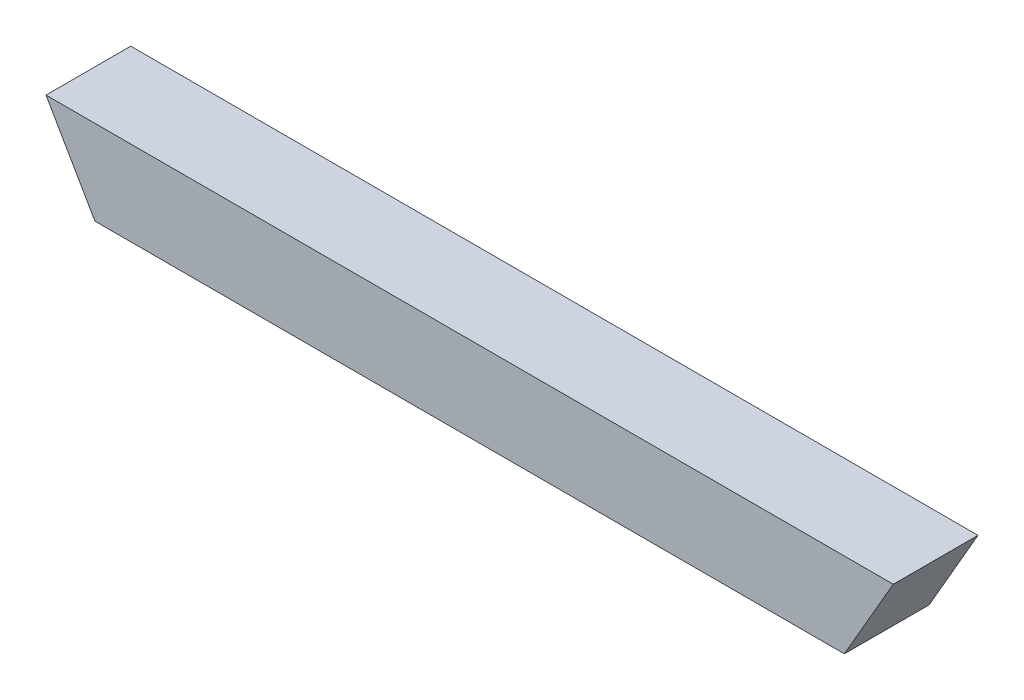
ISO-10303-21;
HEADER;
FILE_DESCRIPTION(('STEP AP214'),'2;1');
FILE_NAME('part.step','',(''),(''),'','','');
FILE_SCHEMA(('AUTOMOTIVE_DESIGN { 1 0 10303 214 1 1 1 1 }'));
ENDSEC;
DATA;
#1=APPLICATION_CONTEXT('core data for automotive mechanical design processes');
#2=APPLICATION_PROTOCOL_DEFINITION('international standard','automotive_design',2000,#1);
#3=PRODUCT_CONTEXT('',#1,'mechanical');
#4=PRODUCT('Part','Part','',(#3));
#5=PRODUCT_RELATED_PRODUCT_CATEGORY('part','',(#4));
#6=PRODUCT_DEFINITION_FORMATION('','',#4);
#7=PRODUCT_DEFINITION_CONTEXT('part definition',#1,'design');
#8=PRODUCT_DEFINITION('design','',#6,#7);
#9=PRODUCT_DEFINITION_SHAPE('','',#8);
#10=(LENGTH_UNIT() NAMED_UNIT(*) SI_UNIT(.MILLI.,.METRE.));
#11=(NAMED_UNIT(*) PLANE_ANGLE_UNIT() SI_UNIT($,.RADIAN.));
#12=(NAMED_UNIT(*) SI_UNIT($,.STERADIAN.) SOLID_ANGLE_UNIT());
#13=UNCERTAINTY_MEASURE_WITH_UNIT(LENGTH_MEASURE(1.E-05),#10,'distance_accuracy_value','');
#14=(GEOMETRIC_REPRESENTATION_CONTEXT(3) GLOBAL_UNCERTAINTY_ASSIGNED_CONTEXT((#13)) GLOBAL_UNIT_ASSIGNED_CONTEXT((#10,
#11,#12)) REPRESENTATION_CONTEXT('',''));
#15=CARTESIAN_POINT('',(0.,0.,0.));
#16=DIRECTION('',(0.,0.,1.));
#17=DIRECTION('',(1.,0.,0.));
#18=AXIS2_PLACEMENT_3D('',#15,#16,#17);
#19=CARTESIAN_POINT('',(88.4529946162075,-19.9999999999999,20.));
#20=DIRECTION('',(-0.866025403784439,0.499999999999999,0.));
#21=DIRECTION('',(-0.499999999999999,-0.866025403784439,0.));
#22=AXIS2_PLACEMENT_3D('',#19,#20,#21);
#23=PLANE('',#22);
#24=DIRECTION('',(0.499999999999999,0.866025403784439,0.));
#25=VECTOR('',#24,1.);
#26=CARTESIAN_POINT('',(88.4529946162075,-19.9999999999999,0.));
#27=LINE('',#26,#25);
#28=CARTESIAN_POINT('',(88.4529946162075,-19.9999999999999,0.));
#29=VERTEX_POINT('',#28);
#30=CARTESIAN_POINT('',(100.,0.,0.));
#31=VERTEX_POINT('',#30);
#32=EDGE_CURVE('E96',#29,#31,#27,.T.);
#33=ORIENTED_EDGE('',*,*,#32,.T.);
#34=DIRECTION('',(0.,0.,-1.));
#35=VECTOR('',#34,1.);
#36=CARTESIAN_POINT('',(100.,0.,20.));
#37=LINE('',#36,#35);
#38=CARTESIAN_POINT('',(100.,0.,20.));
#39=VERTEX_POINT('',#38);
#40=EDGE_CURVE('E11',#39,#31,#37,.T.);
#41=ORIENTED_EDGE('',*,*,#40,.F.);
#42=DIRECTION('',(0.499999999999999,0.866025403784439,0.));
#43=VECTOR('',#42,1.);
#44=CARTESIAN_POINT('',(88.4529946162075,-19.9999999999999,20.));
#45=LINE('',#44,#43);
#46=CARTESIAN_POINT('',(88.4529946162075,-19.9999999999999,20.));
#47=VERTEX_POINT('',#46);
#48=EDGE_CURVE('E84',#47,#39,#45,.T.);
#49=ORIENTED_EDGE('',*,*,#48,.F.);
#50=DIRECTION('',(0.,0.,-1.));
#51=VECTOR('',#50,1.);
#52=CARTESIAN_POINT('',(88.4529946162075,-19.9999999999999,20.));
#53=LINE('',#52,#51);
#54=EDGE_CURVE('E92',#47,#29,#53,.T.);
#55=ORIENTED_EDGE('',*,*,#54,.T.);
#56=EDGE_LOOP('',(#33,#41,#49,#55));
#57=FACE_BOUND('',#56,.T.);
#58=ADVANCED_FACE('F33',(#57),#23,.F.);
#59=CARTESIAN_POINT('',(-100.,0.,20.));
#60=DIRECTION('',(0.,-1.,0.));
#61=DIRECTION('',(1.,0.,0.));
#62=AXIS2_PLACEMENT_3D('',#59,#60,#61);
#63=PLANE('',#62);
#64=DIRECTION('',(-1.,0.,0.));
#65=VECTOR('',#64,1.);
#66=CARTESIAN_POINT('',(-100.,0.,0.));
#67=LINE('',#66,#65);
#68=CARTESIAN_POINT('',(-100.,0.,0.));
#69=VERTEX_POINT('',#68);
#70=EDGE_CURVE('E88',#31,#69,#67,.T.);
#71=ORIENTED_EDGE('',*,*,#70,.T.);
#72=DIRECTION('',(0.,0.,-1.));
#73=VECTOR('',#72,1.);
#74=CARTESIAN_POINT('',(-100.,0.,20.));
#75=LINE('',#74,#73);
#76=CARTESIAN_POINT('',(-100.,0.,20.));
#77=VERTEX_POINT('',#76);
#78=EDGE_CURVE('E41',#77,#69,#75,.T.);
#79=ORIENTED_EDGE('',*,*,#78,.F.);
#80=DIRECTION('',(-1.,0.,0.));
#81=VECTOR('',#80,1.);
#82=CARTESIAN_POINT('',(-100.,0.,20.));
#83=LINE('',#82,#81);
#84=EDGE_CURVE('E79',#39,#77,#83,.T.);
#85=ORIENTED_EDGE('',*,*,#84,.F.);
#86=ORIENTED_EDGE('',*,*,#40,.T.);
#87=EDGE_LOOP('',(#71,#79,#85,#86));
#88=FACE_BOUND('',#87,.T.);
#89=ADVANCED_FACE('F87',(#88),#63,.F.);
#90=CARTESIAN_POINT('',(-100.,0.,20.));
#91=DIRECTION('',(0.86602540378444,0.499999999999998,0.));
#92=DIRECTION('',(-0.499999999999998,0.86602540378444,0.));
#93=AXIS2_PLACEMENT_3D('',#90,#91,#92);
#94=PLANE('',#93);
#95=DIRECTION('',(0.499999999999998,-0.86602540378444,0.));
#96=VECTOR('',#95,1.);
#97=CARTESIAN_POINT('',(-100.,0.,0.));
#98=LINE('',#97,#96);
#99=CARTESIAN_POINT('',(-88.4529946162075,-20.,0.));
#100=VERTEX_POINT('',#99);
#101=EDGE_CURVE('E66',#69,#100,#98,.T.);
#102=ORIENTED_EDGE('',*,*,#101,.T.);
#103=DIRECTION('',(0.,0.,-1.));
#104=VECTOR('',#103,1.);
#105=CARTESIAN_POINT('',(-88.4529946162075,-20.,20.));
#106=LINE('',#105,#104);
#107=CARTESIAN_POINT('',(-88.4529946162075,-20.,20.));
#108=VERTEX_POINT('',#107);
#109=EDGE_CURVE('E89',#108,#100,#106,.T.);
#110=ORIENTED_EDGE('',*,*,#109,.F.);
#111=DIRECTION('',(0.499999999999998,-0.86602540378444,0.));
#112=VECTOR('',#111,1.);
#113=CARTESIAN_POINT('',(-100.,0.,20.));
#114=LINE('',#113,#112);
#115=EDGE_CURVE('E82',#77,#108,#114,.T.);
#116=ORIENTED_EDGE('',*,*,#115,.F.);
#117=ORIENTED_EDGE('',*,*,#78,.T.);
#118=EDGE_LOOP('',(#102,#110,#116,#117));
#119=FACE_BOUND('',#118,.T.);
#120=ADVANCED_FACE('F90',(#119),#94,.F.);
#121=CARTESIAN_POINT('',(88.4529946162075,-19.9999999999999,20.));
#122=DIRECTION('',(0.,1.,0.));
#123=DIRECTION('',(-1.,0.,0.));
#124=AXIS2_PLACEMENT_3D('',#121,#122,#123);
#125=PLANE('',#124);
#126=DIRECTION('',(1.,0.,0.));
#127=VECTOR('',#126,1.);
#128=CARTESIAN_POINT('',(88.4529946162075,-19.9999999999999,0.));
#129=LINE('',#128,#127);
#130=EDGE_CURVE('E72',#100,#29,#129,.T.);
#131=ORIENTED_EDGE('',*,*,#130,.T.);
#132=ORIENTED_EDGE('',*,*,#54,.F.);
#133=DIRECTION('',(1.,0.,0.));
#134=VECTOR('',#133,1.);
#135=CARTESIAN_POINT('',(88.4529946162075,-19.9999999999999,20.));
#136=LINE('',#135,#134);
#137=EDGE_CURVE('E49',#108,#47,#136,.T.);
#138=ORIENTED_EDGE('',*,*,#137,.F.);
#139=ORIENTED_EDGE('',*,*,#109,.T.);
#140=EDGE_LOOP('',(#131,#132,#138,#139));
#141=FACE_BOUND('',#140,.T.);
#142=ADVANCED_FACE('F103',(#141),#125,.F.);
#143=CARTESIAN_POINT('',(0.,0.,20.));
#144=DIRECTION('',(0.,0.,-1.));
#145=DIRECTION('',(-1.,0.,0.));
#146=AXIS2_PLACEMENT_3D('',#143,#144,#145);
#147=PLANE('',#146);
#148=ORIENTED_EDGE('',*,*,#48,.T.);
#149=ORIENTED_EDGE('',*,*,#84,.T.);
#150=ORIENTED_EDGE('',*,*,#115,.T.);
#151=ORIENTED_EDGE('',*,*,#137,.T.);
#152=EDGE_LOOP('',(#148,#149,#150,#151));
#153=FACE_BOUND('',#152,.T.);
#154=ADVANCED_FACE('F80',(#153),#147,.F.);
#155=CARTESIAN_POINT('',(0.,0.,0.));
#156=DIRECTION('',(0.,0.,-1.));
#157=DIRECTION('',(-1.,0.,0.));
#158=AXIS2_PLACEMENT_3D('',#155,#156,#157);
#159=PLANE('',#158);
#160=ORIENTED_EDGE('',*,*,#32,.F.);
#161=ORIENTED_EDGE('',*,*,#130,.F.);
#162=ORIENTED_EDGE('',*,*,#101,.F.);
#163=ORIENTED_EDGE('',*,*,#70,.F.);
#164=EDGE_LOOP('',(#160,#161,#162,#163));
#165=FACE_BOUND('',#164,.T.);
#166=ADVANCED_FACE('F106',(#165),#159,.T.);
#167=CLOSED_SHELL('',(#58,#89,#120,#142,#154,#166));
#168=MANIFOLD_SOLID_BREP('B2',#167);
#169=ADVANCED_BREP_SHAPE_REPRESENTATION('',(#18,#168),#14);
#170=SHAPE_DEFINITION_REPRESENTATION(#9,#169);
ENDSEC;
END-ISO-10303-21;
